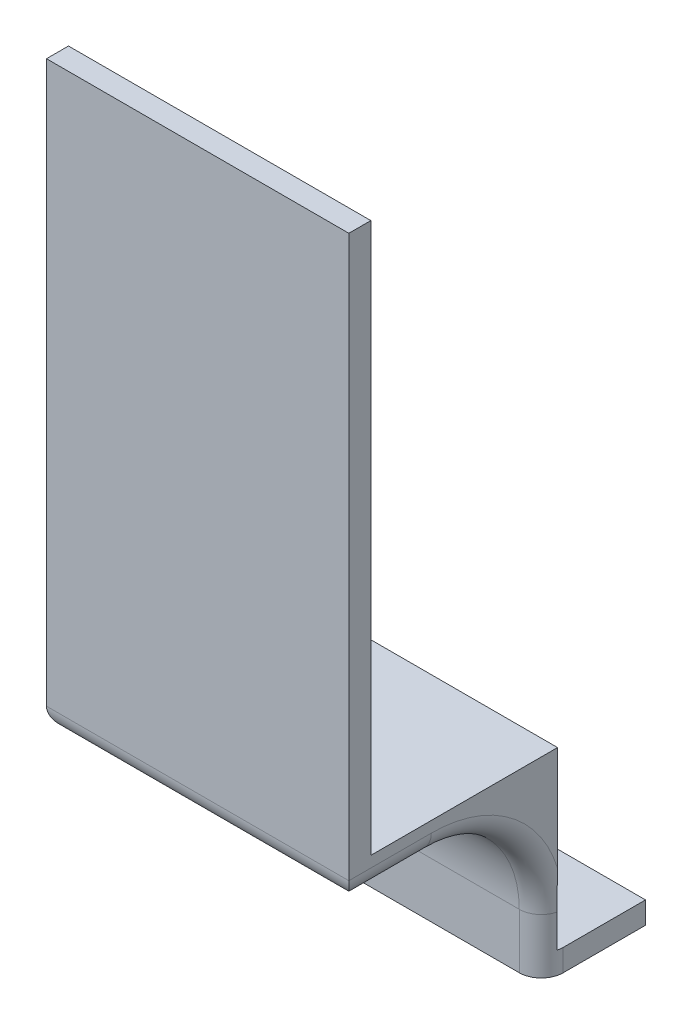
ISO-10303-21;
HEADER;
FILE_DESCRIPTION(('STEP AP214'),'2;1');
FILE_NAME('part.step','',(''),(''),'','','');
FILE_SCHEMA(('AUTOMOTIVE_DESIGN { 1 0 10303 214 1 1 1 1 }'));
ENDSEC;
DATA;
#1=APPLICATION_CONTEXT('core data for automotive mechanical design processes');
#2=APPLICATION_PROTOCOL_DEFINITION('international standard','automotive_design',2000,#1);
#3=PRODUCT_CONTEXT('',#1,'mechanical');
#4=PRODUCT('Part','Part','',(#3));
#5=PRODUCT_RELATED_PRODUCT_CATEGORY('part','',(#4));
#6=PRODUCT_DEFINITION_FORMATION('','',#4);
#7=PRODUCT_DEFINITION_CONTEXT('part definition',#1,'design');
#8=PRODUCT_DEFINITION('design','',#6,#7);
#9=PRODUCT_DEFINITION_SHAPE('','',#8);
#10=(LENGTH_UNIT() NAMED_UNIT(*) SI_UNIT(.MILLI.,.METRE.));
#11=(NAMED_UNIT(*) PLANE_ANGLE_UNIT() SI_UNIT($,.RADIAN.));
#12=(NAMED_UNIT(*) SI_UNIT($,.STERADIAN.) SOLID_ANGLE_UNIT());
#13=UNCERTAINTY_MEASURE_WITH_UNIT(LENGTH_MEASURE(1.E-05),#10,'distance_accuracy_value','');
#14=(GEOMETRIC_REPRESENTATION_CONTEXT(3) GLOBAL_UNCERTAINTY_ASSIGNED_CONTEXT((#13)) GLOBAL_UNIT_ASSIGNED_CONTEXT((#10,
#11,#12)) REPRESENTATION_CONTEXT('',''));
#15=CARTESIAN_POINT('',(0.,0.,0.));
#16=DIRECTION('',(0.,0.,1.));
#17=DIRECTION('',(1.,0.,0.));
#18=AXIS2_PLACEMENT_3D('',#15,#16,#17);
#19=CARTESIAN_POINT('',(15.,6.,-5.5));
#20=DIRECTION('',(-1.,0.,0.));
#21=DIRECTION('',(0.,0.,1.));
#22=AXIS2_PLACEMENT_3D('',#19,#20,#21);
#23=PLANE('',#22);
#24=DIRECTION('',(0.,0.,-1.));
#25=VECTOR('',#24,1.);
#26=CARTESIAN_POINT('',(15.,68.,2.5));
#27=LINE('',#26,#25);
#28=CARTESIAN_POINT('',(15.,68.,21.4824022050211));
#29=VERTEX_POINT('',#28);
#30=CARTESIAN_POINT('',(15.,68.,19.4824022050211));
#31=VERTEX_POINT('',#30);
#32=EDGE_CURVE('E168',#29,#31,#27,.T.);
#33=ORIENTED_EDGE('',*,*,#32,.F.);
#34=DIRECTION('',(0.,-1.,0.));
#35=VECTOR('',#34,1.);
#36=CARTESIAN_POINT('',(15.,68.,21.4824022050211));
#37=LINE('',#36,#35);
#38=CARTESIAN_POINT('',(15.,17.,21.4824022050211));
#39=VERTEX_POINT('',#38);
#40=EDGE_CURVE('E172',#29,#39,#37,.T.);
#41=ORIENTED_EDGE('',*,*,#40,.T.);
#42=DIRECTION('',(0.,0.,-1.));
#43=VECTOR('',#42,1.);
#44=CARTESIAN_POINT('',(15.,17.,-5.5));
#45=LINE('',#44,#43);
#46=CARTESIAN_POINT('',(15.,17.,13.9824022050211));
#47=VERTEX_POINT('',#46);
#48=EDGE_CURVE('E263',#39,#47,#45,.T.);
#49=ORIENTED_EDGE('',*,*,#48,.T.);
#50=CARTESIAN_POINT('',(15.,5.,13.9824022050211));
#51=DIRECTION('',(-1.,0.,0.));
#52=DIRECTION('',(0.,0.,1.));
#53=AXIS2_PLACEMENT_3D('',#50,#51,#52);
#54=CIRCLE('',#53,12.);
#55=CARTESIAN_POINT('',(15.,8.48632178694496,2.5));
#56=VERTEX_POINT('',#55);
#57=EDGE_CURVE('E262',#47,#56,#54,.T.);
#58=ORIENTED_EDGE('',*,*,#57,.T.);
#59=DIRECTION('',(0.,-1.,0.));
#60=VECTOR('',#59,1.);
#61=CARTESIAN_POINT('',(15.,18.,2.5));
#62=LINE('',#61,#60);
#63=CARTESIAN_POINT('',(15.,18.,2.5));
#64=VERTEX_POINT('',#63);
#65=EDGE_CURVE('E209',#64,#56,#62,.T.);
#66=ORIENTED_EDGE('',*,*,#65,.F.);
#67=DIRECTION('',(0.,0.,-1.));
#68=VECTOR('',#67,1.);
#69=CARTESIAN_POINT('',(15.,18.,5.5));
#70=LINE('',#69,#68);
#71=CARTESIAN_POINT('',(15.,18.,19.4824022050211));
#72=VERTEX_POINT('',#71);
#73=EDGE_CURVE('E213',#72,#64,#70,.T.);
#74=ORIENTED_EDGE('',*,*,#73,.F.);
#75=DIRECTION('',(0.,-1.,0.));
#76=VECTOR('',#75,1.);
#77=CARTESIAN_POINT('',(15.,68.,19.4824022050211));
#78=LINE('',#77,#76);
#79=EDGE_CURVE('E180',#31,#72,#78,.T.);
#80=ORIENTED_EDGE('',*,*,#79,.F.);
#81=EDGE_LOOP('',(#33,#41,#49,#58,#66,#74,#80));
#82=FACE_BOUND('',#81,.T.);
#83=ADVANCED_FACE('F50',(#82),#23,.F.);
#84=DIRECTION('',(0.,0.,1.));
#85=VECTOR('',#84,1.);
#86=CARTESIAN_POINT('',(15.,2.,-5.5));
#87=LINE('',#86,#85);
#88=CARTESIAN_POINT('',(15.,2.,-5.5));
#89=VERTEX_POINT('',#88);
#90=CARTESIAN_POINT('',(15.,2.,1.98240220502108));
#91=VERTEX_POINT('',#90);
#92=EDGE_CURVE('E236',#89,#91,#87,.T.);
#93=ORIENTED_EDGE('',*,*,#92,.T.);
#94=DIRECTION('',(0.,1.,0.));
#95=VECTOR('',#94,1.);
#96=CARTESIAN_POINT('',(15.,6.,1.98240220502108));
#97=LINE('',#96,#95);
#98=CARTESIAN_POINT('',(15.,0.,1.98240220502108));
#99=VERTEX_POINT('',#98);
#100=EDGE_CURVE('E261',#91,#99,#97,.F.);
#101=ORIENTED_EDGE('',*,*,#100,.T.);
#102=DIRECTION('',(0.,0.,-1.));
#103=VECTOR('',#102,1.);
#104=CARTESIAN_POINT('',(15.,0.,-5.5));
#105=LINE('',#104,#103);
#106=CARTESIAN_POINT('',(15.,0.,-5.5));
#107=VERTEX_POINT('',#106);
#108=EDGE_CURVE('E237',#99,#107,#105,.T.);
#109=ORIENTED_EDGE('',*,*,#108,.T.);
#110=DIRECTION('',(0.,-1.,0.));
#111=VECTOR('',#110,1.);
#112=CARTESIAN_POINT('',(15.,6.,-5.5));
#113=LINE('',#112,#111);
#114=EDGE_CURVE('E242',#89,#107,#113,.T.);
#115=ORIENTED_EDGE('',*,*,#114,.F.);
#116=EDGE_LOOP('',(#93,#101,#109,#115));
#117=FACE_BOUND('',#116,.T.);
#118=ADVANCED_FACE('F326',(#117),#23,.F.);
#119=CARTESIAN_POINT('',(-12.5,0.,0.));
#120=DIRECTION('',(1.,0.,0.));
#121=DIRECTION('',(0.,0.,-1.));
#122=AXIS2_PLACEMENT_3D('',#119,#120,#121);
#123=PLANE('',#122);
#124=DIRECTION('',(0.,0.,1.));
#125=VECTOR('',#124,1.);
#126=CARTESIAN_POINT('',(-12.5,0.,-5.5));
#127=LINE('',#126,#125);
#128=CARTESIAN_POINT('',(-12.5,0.,-5.5));
#129=VERTEX_POINT('',#128);
#130=CARTESIAN_POINT('',(-12.5,0.,1.98240220502108));
#131=VERTEX_POINT('',#130);
#132=EDGE_CURVE('E217',#129,#131,#127,.T.);
#133=ORIENTED_EDGE('',*,*,#132,.T.);
#134=DIRECTION('',(0.,1.,0.));
#135=VECTOR('',#134,1.);
#136=CARTESIAN_POINT('',(-12.5,0.,1.98240220502108));
#137=LINE('',#136,#135);
#138=CARTESIAN_POINT('',(-12.5,2.,1.98240220502108));
#139=VERTEX_POINT('',#138);
#140=EDGE_CURVE('E258',#131,#139,#137,.T.);
#141=ORIENTED_EDGE('',*,*,#140,.T.);
#142=DIRECTION('',(0.,0.,1.));
#143=VECTOR('',#142,1.);
#144=CARTESIAN_POINT('',(-12.5,2.,-13.5));
#145=LINE('',#144,#143);
#146=CARTESIAN_POINT('',(-12.5,2.,-5.5));
#147=VERTEX_POINT('',#146);
#148=EDGE_CURVE('E223',#147,#139,#145,.T.);
#149=ORIENTED_EDGE('',*,*,#148,.F.);
#150=DIRECTION('',(0.,-1.,0.));
#151=VECTOR('',#150,1.);
#152=CARTESIAN_POINT('',(-12.5,0.,-5.5));
#153=LINE('',#152,#151);
#154=EDGE_CURVE('E218',#147,#129,#153,.T.);
#155=ORIENTED_EDGE('',*,*,#154,.T.);
#156=EDGE_LOOP('',(#133,#141,#149,#155));
#157=FACE_BOUND('',#156,.T.);
#158=ADVANCED_FACE('F334',(#157),#123,.F.);
#159=CARTESIAN_POINT('',(-32.,18.,3.98240220502108));
#160=DIRECTION('',(0.,0.,-1.));
#161=DIRECTION('',(0.,1.,0.));
#162=AXIS2_PLACEMENT_3D('',#159,#160,#161);
#163=PLANE('',#162);
#164=DIRECTION('',(1.,0.,0.));
#165=VECTOR('',#164,1.);
#166=CARTESIAN_POINT('',(-32.,0.,3.98240220502108));
#167=LINE('',#166,#165);
#168=CARTESIAN_POINT('',(-10.5,0.,3.98240220502108));
#169=VERTEX_POINT('',#168);
#170=CARTESIAN_POINT('',(13.,0.,3.98240220502108));
#171=VERTEX_POINT('',#170);
#172=EDGE_CURVE('E199',#169,#171,#167,.T.);
#173=ORIENTED_EDGE('',*,*,#172,.T.);
#174=DIRECTION('',(0.,1.,0.));
#175=VECTOR('',#174,1.);
#176=CARTESIAN_POINT('',(13.,18.,3.98240220502108));
#177=LINE('',#176,#175);
#178=CARTESIAN_POINT('',(13.,5.,3.98240220502108));
#179=VERTEX_POINT('',#178);
#180=EDGE_CURVE('E267',#171,#179,#177,.T.);
#181=ORIENTED_EDGE('',*,*,#180,.T.);
#182=DIRECTION('',(1.,0.,0.));
#183=VECTOR('',#182,1.);
#184=CARTESIAN_POINT('',(-12.5,5.,3.98240220502108));
#185=LINE('',#184,#183);
#186=CARTESIAN_POINT('',(-10.5,5.,3.98240220502108));
#187=VERTEX_POINT('',#186);
#188=EDGE_CURVE('E252',#179,#187,#185,.F.);
#189=ORIENTED_EDGE('',*,*,#188,.T.);
#190=DIRECTION('',(0.,1.,0.));
#191=VECTOR('',#190,1.);
#192=CARTESIAN_POINT('',(-10.5,18.,3.98240220502108));
#193=LINE('',#192,#191);
#194=EDGE_CURVE('E270',#187,#169,#193,.F.);
#195=ORIENTED_EDGE('',*,*,#194,.T.);
#196=EDGE_LOOP('',(#173,#181,#189,#195));
#197=FACE_BOUND('',#196,.T.);
#198=ADVANCED_FACE('F292',(#197),#163,.F.);
#199=CARTESIAN_POINT('',(0.,0.,0.));
#200=DIRECTION('',(0.,1.,0.));
#201=DIRECTION('',(0.,0.,1.));
#202=AXIS2_PLACEMENT_3D('',#199,#200,#201);
#203=PLANE('',#202);
#204=CARTESIAN_POINT('',(-7.5,0.,-2.));
#205=DIRECTION('',(0.,1.,0.));
#206=DIRECTION('',(0.,0.,1.));
#207=AXIS2_PLACEMENT_3D('',#204,#205,#206);
#208=CIRCLE('',#207,1.75);
#209=CARTESIAN_POINT('',(-7.5,0.,-0.25));
#210=VERTEX_POINT('',#209);
#211=EDGE_CURVE('E231',#210,#210,#208,.T.);
#212=ORIENTED_EDGE('',*,*,#211,.T.);
#213=EDGE_LOOP('',(#212));
#214=FACE_BOUND('',#213,.T.);
#215=CARTESIAN_POINT('',(7.5,0.,-2.));
#216=DIRECTION('',(0.,1.,0.));
#217=DIRECTION('',(0.,0.,1.));
#218=AXIS2_PLACEMENT_3D('',#215,#216,#217);
#219=CIRCLE('',#218,1.75);
#220=CARTESIAN_POINT('',(7.5,0.,-0.249999999999999));
#221=VERTEX_POINT('',#220);
#222=EDGE_CURVE('E227',#221,#221,#219,.T.);
#223=ORIENTED_EDGE('',*,*,#222,.T.);
#224=EDGE_LOOP('',(#223));
#225=FACE_BOUND('',#224,.T.);
#226=ORIENTED_EDGE('',*,*,#108,.F.);
#227=CARTESIAN_POINT('',(13.,0.,1.98240220502108));
#228=DIRECTION('',(0.,1.,0.));
#229=DIRECTION('',(0.,0.,1.));
#230=AXIS2_PLACEMENT_3D('',#227,#228,#229);
#231=CIRCLE('',#230,2.);
#232=EDGE_CURVE('E394',#99,#171,#231,.F.);
#233=ORIENTED_EDGE('',*,*,#232,.T.);
#234=ORIENTED_EDGE('',*,*,#172,.F.);
#235=CARTESIAN_POINT('',(-10.5,0.,1.98240220502108));
#236=DIRECTION('',(0.,1.,0.));
#237=DIRECTION('',(0.,0.,1.));
#238=AXIS2_PLACEMENT_3D('',#235,#236,#237);
#239=CIRCLE('',#238,2.);
#240=EDGE_CURVE('E367',#169,#131,#239,.F.);
#241=ORIENTED_EDGE('',*,*,#240,.T.);
#242=ORIENTED_EDGE('',*,*,#132,.F.);
#243=DIRECTION('',(-1.,0.,0.));
#244=VECTOR('',#243,1.);
#245=CARTESIAN_POINT('',(-15.,0.,-5.5));
#246=LINE('',#245,#244);
#247=EDGE_CURVE('E241',#107,#129,#246,.T.);
#248=ORIENTED_EDGE('',*,*,#247,.F.);
#249=EDGE_LOOP('',(#226,#233,#234,#241,#242,#248));
#250=FACE_BOUND('',#249,.T.);
#251=ADVANCED_FACE('F412',(#214,#225,#250),#203,.F.);
#252=CARTESIAN_POINT('',(0.,18.,0.));
#253=DIRECTION('',(0.,1.,0.));
#254=DIRECTION('',(0.,0.,1.));
#255=AXIS2_PLACEMENT_3D('',#252,#253,#254);
#256=PLANE('',#255);
#257=DIRECTION('',(0.,0.,1.));
#258=VECTOR('',#257,1.);
#259=CARTESIAN_POINT('',(-12.5,18.,5.5));
#260=LINE('',#259,#258);
#261=CARTESIAN_POINT('',(-12.5,18.,2.5));
#262=VERTEX_POINT('',#261);
#263=CARTESIAN_POINT('',(-12.5,18.,19.4824022050211));
#264=VERTEX_POINT('',#263);
#265=EDGE_CURVE('E215',#262,#264,#260,.T.);
#266=ORIENTED_EDGE('',*,*,#265,.T.);
#267=DIRECTION('',(-1.,0.,0.));
#268=VECTOR('',#267,1.);
#269=CARTESIAN_POINT('',(-12.5,18.,19.4824022050211));
#270=LINE('',#269,#268);
#271=EDGE_CURVE('E187',#72,#264,#270,.T.);
#272=ORIENTED_EDGE('',*,*,#271,.F.);
#273=ORIENTED_EDGE('',*,*,#73,.T.);
#274=DIRECTION('',(-1.,0.,0.));
#275=VECTOR('',#274,1.);
#276=CARTESIAN_POINT('',(-12.5,18.,2.5));
#277=LINE('',#276,#275);
#278=EDGE_CURVE('E203',#64,#262,#277,.T.);
#279=ORIENTED_EDGE('',*,*,#278,.T.);
#280=EDGE_LOOP('',(#266,#272,#273,#279));
#281=FACE_BOUND('',#280,.T.);
#282=ADVANCED_FACE('F295',(#281),#256,.T.);
#283=CARTESIAN_POINT('',(129.,2.,-13.5));
#284=DIRECTION('',(0.,-1.,0.));
#285=DIRECTION('',(0.,0.,-1.));
#286=AXIS2_PLACEMENT_3D('',#283,#284,#285);
#287=PLANE('',#286);
#288=CARTESIAN_POINT('',(7.5,2.,-2.));
#289=DIRECTION('',(0.,-1.,0.));
#290=DIRECTION('',(0.,0.,-1.));
#291=AXIS2_PLACEMENT_3D('',#288,#289,#290);
#292=CIRCLE('',#291,1.75);
#293=CARTESIAN_POINT('',(7.5,2.,-3.75));
#294=VERTEX_POINT('',#293);
#295=EDGE_CURVE('E222',#294,#294,#292,.T.);
#296=ORIENTED_EDGE('',*,*,#295,.T.);
#297=EDGE_LOOP('',(#296));
#298=FACE_BOUND('',#297,.T.);
#299=CARTESIAN_POINT('',(-7.5,2.,-2.));
#300=DIRECTION('',(0.,-1.,0.));
#301=DIRECTION('',(0.,0.,-1.));
#302=AXIS2_PLACEMENT_3D('',#299,#300,#301);
#303=CIRCLE('',#302,1.75);
#304=CARTESIAN_POINT('',(-7.5,2.,-3.75));
#305=VERTEX_POINT('',#304);
#306=EDGE_CURVE('E229',#305,#305,#303,.T.);
#307=ORIENTED_EDGE('',*,*,#306,.T.);
#308=EDGE_LOOP('',(#307));
#309=FACE_BOUND('',#308,.T.);
#310=DIRECTION('',(-1.,0.,0.));
#311=VECTOR('',#310,1.);
#312=CARTESIAN_POINT('',(-12.5,2.,2.5));
#313=LINE('',#312,#311);
#314=CARTESIAN_POINT('',(14.931862449201,2.,2.5));
#315=VERTEX_POINT('',#314);
#316=CARTESIAN_POINT('',(-12.431862449201,2.,2.5));
#317=VERTEX_POINT('',#316);
#318=EDGE_CURVE('E196',#315,#317,#313,.T.);
#319=ORIENTED_EDGE('',*,*,#318,.F.);
#320=CARTESIAN_POINT('',(13.,2.,1.98240220502108));
#321=DIRECTION('',(0.,-1.,0.));
#322=DIRECTION('',(0.,0.,-1.));
#323=AXIS2_PLACEMENT_3D('',#320,#321,#322);
#324=CIRCLE('',#323,2.);
#325=EDGE_CURVE('E391',#315,#91,#324,.F.);
#326=ORIENTED_EDGE('',*,*,#325,.T.);
#327=ORIENTED_EDGE('',*,*,#92,.F.);
#328=DIRECTION('',(1.,0.,0.));
#329=VECTOR('',#328,1.);
#330=CARTESIAN_POINT('',(-15.,2.,-5.5));
#331=LINE('',#330,#329);
#332=EDGE_CURVE('E250',#147,#89,#331,.T.);
#333=ORIENTED_EDGE('',*,*,#332,.F.);
#334=ORIENTED_EDGE('',*,*,#148,.T.);
#335=CARTESIAN_POINT('',(-10.5,2.,1.98240220502108));
#336=DIRECTION('',(0.,-1.,0.));
#337=DIRECTION('',(0.,0.,-1.));
#338=AXIS2_PLACEMENT_3D('',#335,#336,#337);
#339=CIRCLE('',#338,2.);
#340=EDGE_CURVE('E398',#139,#317,#339,.F.);
#341=ORIENTED_EDGE('',*,*,#340,.T.);
#342=EDGE_LOOP('',(#319,#326,#327,#333,#334,#341));
#343=FACE_BOUND('',#342,.T.);
#344=ADVANCED_FACE('F403',(#298,#309,#343),#287,.F.);
#345=DIRECTION('',(0.,-1.,0.));
#346=VECTOR('',#345,1.);
#347=CARTESIAN_POINT('',(-12.5,68.,21.4824022050211));
#348=LINE('',#347,#346);
#349=CARTESIAN_POINT('',(-12.5,68.,21.4824022050211));
#350=VERTEX_POINT('',#349);
#351=CARTESIAN_POINT('',(-12.5,17.,21.4824022050211));
#352=VERTEX_POINT('',#351);
#353=EDGE_CURVE('E183',#350,#352,#348,.T.);
#354=ORIENTED_EDGE('',*,*,#353,.F.);
#355=DIRECTION('',(0.,0.,-1.));
#356=VECTOR('',#355,1.);
#357=CARTESIAN_POINT('',(-12.5,68.,0.));
#358=LINE('',#357,#356);
#359=CARTESIAN_POINT('',(-12.5,68.,19.4824022050211));
#360=VERTEX_POINT('',#359);
#361=EDGE_CURVE('E11',#350,#360,#358,.T.);
#362=ORIENTED_EDGE('',*,*,#361,.T.);
#363=DIRECTION('',(0.,-1.,0.));
#364=VECTOR('',#363,1.);
#365=CARTESIAN_POINT('',(-12.5,68.,19.4824022050211));
#366=LINE('',#365,#364);
#367=EDGE_CURVE('E189',#360,#264,#366,.T.);
#368=ORIENTED_EDGE('',*,*,#367,.T.);
#369=ORIENTED_EDGE('',*,*,#265,.F.);
#370=DIRECTION('',(0.,-1.,0.));
#371=VECTOR('',#370,1.);
#372=CARTESIAN_POINT('',(-12.5,18.,2.5));
#373=LINE('',#372,#371);
#374=CARTESIAN_POINT('',(-12.5,8.48632178694496,2.5));
#375=VERTEX_POINT('',#374);
#376=EDGE_CURVE('E202',#262,#375,#373,.T.);
#377=ORIENTED_EDGE('',*,*,#376,.T.);
#378=CARTESIAN_POINT('',(-12.5,5.,13.9824022050211));
#379=DIRECTION('',(1.,0.,0.));
#380=DIRECTION('',(0.,0.,-1.));
#381=AXIS2_PLACEMENT_3D('',#378,#379,#380);
#382=CIRCLE('',#381,12.);
#383=CARTESIAN_POINT('',(-12.5,17.,13.9824022050211));
#384=VERTEX_POINT('',#383);
#385=EDGE_CURVE('E260',#375,#384,#382,.T.);
#386=ORIENTED_EDGE('',*,*,#385,.T.);
#387=DIRECTION('',(0.,0.,-1.));
#388=VECTOR('',#387,1.);
#389=CARTESIAN_POINT('',(-12.5,17.,0.));
#390=LINE('',#389,#388);
#391=EDGE_CURVE('E251',#384,#352,#390,.F.);
#392=ORIENTED_EDGE('',*,*,#391,.T.);
#393=EDGE_LOOP('',(#354,#362,#368,#369,#377,#386,#392));
#394=FACE_BOUND('',#393,.T.);
#395=ADVANCED_FACE('F422',(#394),#123,.F.);
#396=CARTESIAN_POINT('',(-15.,6.,-5.5));
#397=DIRECTION('',(0.,0.,1.));
#398=DIRECTION('',(1.,0.,0.));
#399=AXIS2_PLACEMENT_3D('',#396,#397,#398);
#400=PLANE('',#399);
#401=ORIENTED_EDGE('',*,*,#154,.F.);
#402=ORIENTED_EDGE('',*,*,#332,.T.);
#403=ORIENTED_EDGE('',*,*,#114,.T.);
#404=ORIENTED_EDGE('',*,*,#247,.T.);
#405=EDGE_LOOP('',(#401,#402,#403,#404));
#406=FACE_BOUND('',#405,.T.);
#407=ADVANCED_FACE('F336',(#406),#400,.F.);
#408=CARTESIAN_POINT('',(7.5,-138.,-2.));
#409=DIRECTION('',(0.,1.,0.));
#410=DIRECTION('',(0.,0.,1.));
#411=AXIS2_PLACEMENT_3D('',#408,#409,#410);
#412=CYLINDRICAL_SURFACE('',#411,1.75);
#413=ORIENTED_EDGE('',*,*,#295,.F.);
#414=EDGE_LOOP('',(#413));
#415=FACE_BOUND('',#414,.T.);
#416=ORIENTED_EDGE('',*,*,#222,.F.);
#417=EDGE_LOOP('',(#416));
#418=FACE_BOUND('',#417,.T.);
#419=ADVANCED_FACE('F447',(#415,#418),#412,.F.);
#420=CARTESIAN_POINT('',(-7.5,-138.,-2.));
#421=DIRECTION('',(0.,1.,0.));
#422=DIRECTION('',(0.,0.,1.));
#423=AXIS2_PLACEMENT_3D('',#420,#421,#422);
#424=CYLINDRICAL_SURFACE('',#423,1.75);
#425=ORIENTED_EDGE('',*,*,#306,.F.);
#426=EDGE_LOOP('',(#425));
#427=FACE_BOUND('',#426,.T.);
#428=ORIENTED_EDGE('',*,*,#211,.F.);
#429=EDGE_LOOP('',(#428));
#430=FACE_BOUND('',#429,.T.);
#431=ADVANCED_FACE('F289',(#427,#430),#424,.F.);
#432=CARTESIAN_POINT('',(-12.5,18.,2.5));
#433=DIRECTION('',(0.,0.,1.));
#434=DIRECTION('',(1.,0.,0.));
#435=AXIS2_PLACEMENT_3D('',#432,#433,#434);
#436=PLANE('',#435);
#437=CARTESIAN_POINT('',(15.,8.48632178694496,2.5));
#438=CARTESIAN_POINT('',(14.999973420591,8.31960303272044,2.5));
#439=CARTESIAN_POINT('',(14.9982400581002,8.152903489605,2.5));
#440=CARTESIAN_POINT('',(14.9925507811653,7.81955774633867,2.5));
#441=CARTESIAN_POINT('',(14.9885951074428,7.65291154236594,2.5));
#442=CARTESIAN_POINT('',(14.9796521788594,7.31966910606931,2.5));
#443=CARTESIAN_POINT('',(14.9746650343504,7.15307287030739,2.5));
#444=CARTESIAN_POINT('',(14.9646588404704,6.81987626461114,2.5));
#445=CARTESIAN_POINT('',(14.9596397902377,6.65327589468723,2.5));
#446=CARTESIAN_POINT('',(14.9504086860296,6.32001584590415,2.5));
#447=CARTESIAN_POINT('',(14.9461968058806,6.15335616199604,2.5));
#448=CARTESIAN_POINT('',(14.9392149448494,5.82000917255926,2.5));
#449=CARTESIAN_POINT('',(14.9364449289972,5.65332186779859,2.5));
#450=CARTESIAN_POINT('',(14.9327440496714,5.31991949717741,2.5));
#451=CARTESIAN_POINT('',(14.9318132522582,5.15320443053485,2.5));
#452=CARTESIAN_POINT('',(14.9318902435984,4.90312691509881,2.5));
#453=CARTESIAN_POINT('',(14.9321614778445,4.81976367997256,2.5));
#454=CARTESIAN_POINT('',(14.9331794494329,4.65304001678202,2.5));
#455=CARTESIAN_POINT('',(14.9339261872392,4.56967958872056,2.5));
#456=CARTESIAN_POINT('',(14.9349028589517,4.48632178694496,2.5));
#457=B_SPLINE_CURVE_WITH_KNOTS('',3,(#437,#438,#439,#440,#441,#442,#443,#444,#445,#446,#447,
#448,#449,#450,#451,#452,#453,#454,#455,#456),.UNSPECIFIED.,.F.,.F.,(4,2,2,2,2,2,2,2,2,4),(0.,
0.500121393637863,1.00018862437835,1.50020238311694,2.00022970331413,2.50036458516036,
3.0004873365191,3.50062805082612,3.75071787258557,4.00080793849823),.UNSPECIFIED.);
#458=CARTESIAN_POINT('',(14.931862449201,5.,2.5));
#459=VERTEX_POINT('',#458);
#460=EDGE_CURVE('E300',#56,#459,#457,.T.);
#461=ORIENTED_EDGE('',*,*,#460,.T.);
#462=DIRECTION('',(0.,1.,0.));
#463=VECTOR('',#462,1.);
#464=CARTESIAN_POINT('',(14.931862449201,18.,2.5));
#465=LINE('',#464,#463);
#466=EDGE_CURVE('E302',#459,#315,#465,.F.);
#467=ORIENTED_EDGE('',*,*,#466,.T.);
#468=ORIENTED_EDGE('',*,*,#318,.T.);
#469=DIRECTION('',(0.,1.,0.));
#470=VECTOR('',#469,1.);
#471=CARTESIAN_POINT('',(-12.431862449201,0.,2.5));
#472=LINE('',#471,#470);
#473=CARTESIAN_POINT('',(-12.431862449201,5.,2.5));
#474=VERTEX_POINT('',#473);
#475=EDGE_CURVE('E278',#317,#474,#472,.T.);
#476=ORIENTED_EDGE('',*,*,#475,.T.);
#477=CARTESIAN_POINT('',(-12.431862449201,5.,2.5));
#478=CARTESIAN_POINT('',(-12.4318148867941,5.16670298116622,2.5));
#479=CARTESIAN_POINT('',(-12.4328338469345,5.3334022257757,2.5));
#480=CARTESIAN_POINT('',(-12.4366579986235,5.66676241533547,2.5));
#481=CARTESIAN_POINT('',(-12.4394629927171,5.8334233624825,2.5));
#482=CARTESIAN_POINT('',(-12.4465124250425,6.16670748968213,2.5));
#483=CARTESIAN_POINT('',(-12.4507568157662,6.33333067079962,2.5));
#484=CARTESIAN_POINT('',(-12.4600301737338,6.66656221557473,2.5));
#485=CARTESIAN_POINT('',(-12.4650591797378,6.83317057809326,2.5));
#486=CARTESIAN_POINT('',(-12.4750645616875,7.16641356419539,2.5));
#487=CARTESIAN_POINT('',(-12.4800409298515,7.33304818806561,2.5));
#488=CARTESIAN_POINT('',(-12.488923031305,7.6663342898719,2.5));
#489=CARTESIAN_POINT('',(-12.4928288472173,7.83298576551375,2.5));
#490=CARTESIAN_POINT('',(-12.49841698057,8.16635030685006,2.5));
#491=CARTESIAN_POINT('',(-12.5000991008819,8.33306337669457,2.5));
#492=CARTESIAN_POINT('',(-12.4998932082432,8.66652778105561,2.5));
#493=CARTESIAN_POINT('',(-12.4980042255866,8.83327911366794,2.5));
#494=CARTESIAN_POINT('',(-12.4936556896548,9.,2.5));
#495=B_SPLINE_CURVE_WITH_KNOTS('',3,(#477,#478,#479,#480,#481,#482,#483,#484,#485,#486,#487,
#488,#489,#490,#491,#492,#493,#494),.UNSPECIFIED.,.F.,.F.,(4,2,2,2,2,2,2,2,4),(0.,
0.500099846565039,1.00014441417451,1.50017247911111,2.00022525328886,2.50035094763816,
3.00043803254286,3.50056944669001,4.00083668723549),.UNSPECIFIED.);
#496=EDGE_CURVE('E275',#474,#375,#495,.T.);
#497=ORIENTED_EDGE('',*,*,#496,.T.);
#498=ORIENTED_EDGE('',*,*,#376,.F.);
#499=ORIENTED_EDGE('',*,*,#278,.F.);
#500=ORIENTED_EDGE('',*,*,#65,.T.);
#501=EDGE_LOOP('',(#461,#467,#468,#476,#497,#498,#499,#500));
#502=FACE_BOUND('',#501,.T.);
#503=ADVANCED_FACE('F285',(#502),#436,.F.);
#504=CARTESIAN_POINT('',(-12.5,15.,19.4824022050211));
#505=DIRECTION('',(0.,1.,0.));
#506=DIRECTION('',(0.,0.,1.));
#507=AXIS2_PLACEMENT_3D('',#504,#505,#506);
#508=PLANE('',#507);
#509=DIRECTION('',(1.,0.,0.));
#510=VECTOR('',#509,1.);
#511=CARTESIAN_POINT('',(15.,15.,13.9824022050211));
#512=LINE('',#511,#510);
#513=CARTESIAN_POINT('',(-10.5,15.,13.9824022050211));
#514=VERTEX_POINT('',#513);
#515=CARTESIAN_POINT('',(13.,15.,13.9824022050211));
#516=VERTEX_POINT('',#515);
#517=EDGE_CURVE('E248',#514,#516,#512,.T.);
#518=ORIENTED_EDGE('',*,*,#517,.T.);
#519=DIRECTION('',(0.,0.,-1.));
#520=VECTOR('',#519,1.);
#521=CARTESIAN_POINT('',(13.,15.,19.4824022050211));
#522=LINE('',#521,#520);
#523=CARTESIAN_POINT('',(13.,15.,19.4824022050211));
#524=VERTEX_POINT('',#523);
#525=EDGE_CURVE('E54',#516,#524,#522,.F.);
#526=ORIENTED_EDGE('',*,*,#525,.T.);
#527=DIRECTION('',(-1.,0.,0.));
#528=VECTOR('',#527,1.);
#529=CARTESIAN_POINT('',(-12.5,15.,19.4824022050211));
#530=LINE('',#529,#528);
#531=CARTESIAN_POINT('',(-10.5,15.,19.4824022050211));
#532=VERTEX_POINT('',#531);
#533=EDGE_CURVE('E64',#524,#532,#530,.T.);
#534=ORIENTED_EDGE('',*,*,#533,.T.);
#535=DIRECTION('',(0.,0.,-1.));
#536=VECTOR('',#535,1.);
#537=CARTESIAN_POINT('',(-10.5,15.,19.4824022050211));
#538=LINE('',#537,#536);
#539=EDGE_CURVE('E390',#532,#514,#538,.T.);
#540=ORIENTED_EDGE('',*,*,#539,.T.);
#541=EDGE_LOOP('',(#518,#526,#534,#540));
#542=FACE_BOUND('',#541,.T.);
#543=ADVANCED_FACE('F287',(#542),#508,.F.);
#544=CARTESIAN_POINT('',(-12.5,68.,21.4824022050211));
#545=DIRECTION('',(0.,0.,1.));
#546=DIRECTION('',(1.,0.,0.));
#547=AXIS2_PLACEMENT_3D('',#544,#545,#546);
#548=PLANE('',#547);
#549=DIRECTION('',(1.,0.,0.));
#550=VECTOR('',#549,1.);
#551=CARTESIAN_POINT('',(-48.,68.,21.4824022050211));
#552=LINE('',#551,#550);
#553=EDGE_CURVE('E161',#350,#29,#552,.T.);
#554=ORIENTED_EDGE('',*,*,#553,.F.);
#555=ORIENTED_EDGE('',*,*,#353,.T.);
#556=DIRECTION('',(-1.,0.,0.));
#557=VECTOR('',#556,1.);
#558=CARTESIAN_POINT('',(15.,17.,21.4824022050211));
#559=LINE('',#558,#557);
#560=EDGE_CURVE('E185',#352,#39,#559,.F.);
#561=ORIENTED_EDGE('',*,*,#560,.T.);
#562=ORIENTED_EDGE('',*,*,#40,.F.);
#563=EDGE_LOOP('',(#554,#555,#561,#562));
#564=FACE_BOUND('',#563,.T.);
#565=ADVANCED_FACE('F179',(#564),#548,.T.);
#566=CARTESIAN_POINT('',(-12.5,68.,19.4824022050211));
#567=DIRECTION('',(0.,0.,-1.));
#568=DIRECTION('',(-1.,0.,0.));
#569=AXIS2_PLACEMENT_3D('',#566,#567,#568);
#570=PLANE('',#569);
#571=ORIENTED_EDGE('',*,*,#79,.T.);
#572=ORIENTED_EDGE('',*,*,#271,.T.);
#573=ORIENTED_EDGE('',*,*,#367,.F.);
#574=DIRECTION('',(1.,0.,0.));
#575=VECTOR('',#574,1.);
#576=CARTESIAN_POINT('',(-12.5,68.,19.4824022050211));
#577=LINE('',#576,#575);
#578=EDGE_CURVE('E193',#360,#31,#577,.T.);
#579=ORIENTED_EDGE('',*,*,#578,.T.);
#580=EDGE_LOOP('',(#571,#572,#573,#579));
#581=FACE_BOUND('',#580,.T.);
#582=ADVANCED_FACE('F345',(#581),#570,.T.);
#583=CARTESIAN_POINT('',(-12.5,5.,13.9824022050211));
#584=DIRECTION('',(-1.,0.,0.));
#585=DIRECTION('',(0.,0.,1.));
#586=AXIS2_PLACEMENT_3D('',#583,#584,#585);
#587=CYLINDRICAL_SURFACE('',#586,10.);
#588=ORIENTED_EDGE('',*,*,#188,.F.);
#589=CARTESIAN_POINT('',(13.,5.,13.9824022050211));
#590=DIRECTION('',(-1.,0.,0.));
#591=DIRECTION('',(0.,0.,1.));
#592=AXIS2_PLACEMENT_3D('',#589,#590,#591);
#593=CIRCLE('',#592,10.);
#594=EDGE_CURVE('E354',#179,#516,#593,.F.);
#595=ORIENTED_EDGE('',*,*,#594,.T.);
#596=ORIENTED_EDGE('',*,*,#517,.F.);
#597=CARTESIAN_POINT('',(-10.5,5.,13.9824022050211));
#598=DIRECTION('',(1.,0.,0.));
#599=DIRECTION('',(0.,0.,-1.));
#600=AXIS2_PLACEMENT_3D('',#597,#598,#599);
#601=CIRCLE('',#600,10.);
#602=EDGE_CURVE('E357',#514,#187,#601,.F.);
#603=ORIENTED_EDGE('',*,*,#602,.T.);
#604=EDGE_LOOP('',(#588,#595,#596,#603));
#605=FACE_BOUND('',#604,.T.);
#606=ADVANCED_FACE('F338',(#605),#587,.F.);
#607=CARTESIAN_POINT('',(-10.5,0.,1.98240220502108));
#608=DIRECTION('',(0.,1.,0.));
#609=DIRECTION('',(0.,0.,1.));
#610=AXIS2_PLACEMENT_3D('',#607,#608,#609);
#611=CYLINDRICAL_SURFACE('',#610,2.);
#612=ORIENTED_EDGE('',*,*,#240,.F.);
#613=ORIENTED_EDGE('',*,*,#194,.F.);
#614=CARTESIAN_POINT('',(-10.5,5.,1.98240220502108));
#615=DIRECTION('',(0.,1.,0.));
#616=DIRECTION('',(0.,0.,1.));
#617=AXIS2_PLACEMENT_3D('',#614,#615,#616);
#618=CIRCLE('',#617,2.);
#619=EDGE_CURVE('E366',#474,#187,#618,.T.);
#620=ORIENTED_EDGE('',*,*,#619,.F.);
#621=ORIENTED_EDGE('',*,*,#475,.F.);
#622=ORIENTED_EDGE('',*,*,#340,.F.);
#623=ORIENTED_EDGE('',*,*,#140,.F.);
#624=EDGE_LOOP('',(#612,#613,#620,#621,#622,#623));
#625=FACE_BOUND('',#624,.T.);
#626=ADVANCED_FACE('F47',(#625),#611,.T.);
#627=CARTESIAN_POINT('',(-10.5,5.,13.9824022050211));
#628=DIRECTION('',(1.,0.,0.));
#629=DIRECTION('',(0.,0.,-1.));
#630=AXIS2_PLACEMENT_3D('',#627,#628,#629);
#631=TOROIDAL_SURFACE('',#630,12.,2.);
#632=ORIENTED_EDGE('',*,*,#619,.T.);
#633=ORIENTED_EDGE('',*,*,#602,.F.);
#634=CARTESIAN_POINT('',(-10.5,17.,13.9824022050211));
#635=DIRECTION('',(0.,0.,1.));
#636=DIRECTION('',(1.,0.,0.));
#637=AXIS2_PLACEMENT_3D('',#634,#635,#636);
#638=CIRCLE('',#637,2.);
#639=EDGE_CURVE('E375',#384,#514,#638,.T.);
#640=ORIENTED_EDGE('',*,*,#639,.F.);
#641=ORIENTED_EDGE('',*,*,#385,.F.);
#642=ORIENTED_EDGE('',*,*,#496,.F.);
#643=EDGE_LOOP('',(#632,#633,#640,#641,#642));
#644=FACE_BOUND('',#643,.T.);
#645=ADVANCED_FACE('F283',(#644),#631,.T.);
#646=CARTESIAN_POINT('',(-10.5,17.,19.4824022050211));
#647=DIRECTION('',(0.,0.,-1.));
#648=DIRECTION('',(-1.,0.,0.));
#649=AXIS2_PLACEMENT_3D('',#646,#647,#648);
#650=CYLINDRICAL_SURFACE('',#649,2.);
#651=ORIENTED_EDGE('',*,*,#639,.T.);
#652=ORIENTED_EDGE('',*,*,#539,.F.);
#653=CARTESIAN_POINT('',(-10.5,17.,19.4824022050211));
#654=DIRECTION('',(-0.707106781186547,0.,-0.707106781186548));
#655=DIRECTION('',(0.707106781186548,0.,-0.707106781186547));
#656=AXIS2_PLACEMENT_3D('',#653,#654,#655);
#657=ELLIPSE('',#656,2.82842712474619,2.);
#658=EDGE_CURVE('E373',#352,#532,#657,.F.);
#659=ORIENTED_EDGE('',*,*,#658,.F.);
#660=ORIENTED_EDGE('',*,*,#391,.F.);
#661=EDGE_LOOP('',(#651,#652,#659,#660));
#662=FACE_BOUND('',#661,.T.);
#663=ADVANCED_FACE('F318',(#662),#650,.T.);
#664=CARTESIAN_POINT('',(-12.5,17.,19.4824022050211));
#665=DIRECTION('',(1.,0.,0.));
#666=DIRECTION('',(0.,0.,-1.));
#667=AXIS2_PLACEMENT_3D('',#664,#665,#666);
#668=CYLINDRICAL_SURFACE('',#667,2.);
#669=ORIENTED_EDGE('',*,*,#658,.T.);
#670=ORIENTED_EDGE('',*,*,#533,.F.);
#671=CARTESIAN_POINT('',(13.,17.,19.4824022050211));
#672=DIRECTION('',(0.707106781186548,0.,-0.707106781186547));
#673=DIRECTION('',(-0.707106781186547,0.,-0.707106781186548));
#674=AXIS2_PLACEMENT_3D('',#671,#672,#673);
#675=ELLIPSE('',#674,2.82842712474619,2.);
#676=EDGE_CURVE('E377',#39,#524,#675,.T.);
#677=ORIENTED_EDGE('',*,*,#676,.F.);
#678=ORIENTED_EDGE('',*,*,#560,.F.);
#679=EDGE_LOOP('',(#669,#670,#677,#678));
#680=FACE_BOUND('',#679,.T.);
#681=ADVANCED_FACE('F320',(#680),#668,.T.);
#682=CARTESIAN_POINT('',(13.,17.,-5.5));
#683=DIRECTION('',(0.,0.,-1.));
#684=DIRECTION('',(-1.,0.,0.));
#685=AXIS2_PLACEMENT_3D('',#682,#683,#684);
#686=CYLINDRICAL_SURFACE('',#685,2.);
#687=ORIENTED_EDGE('',*,*,#676,.T.);
#688=ORIENTED_EDGE('',*,*,#525,.F.);
#689=CARTESIAN_POINT('',(13.,17.,13.9824022050211));
#690=DIRECTION('',(0.,0.,-1.));
#691=DIRECTION('',(-1.,0.,0.));
#692=AXIS2_PLACEMENT_3D('',#689,#690,#691);
#693=CIRCLE('',#692,2.);
#694=EDGE_CURVE('E382',#47,#516,#693,.T.);
#695=ORIENTED_EDGE('',*,*,#694,.F.);
#696=ORIENTED_EDGE('',*,*,#48,.F.);
#697=EDGE_LOOP('',(#687,#688,#695,#696));
#698=FACE_BOUND('',#697,.T.);
#699=ADVANCED_FACE('F315',(#698),#686,.T.);
#700=CARTESIAN_POINT('',(13.,5.,13.9824022050211));
#701=DIRECTION('',(-1.,0.,0.));
#702=DIRECTION('',(0.,0.,1.));
#703=AXIS2_PLACEMENT_3D('',#700,#701,#702);
#704=TOROIDAL_SURFACE('',#703,12.,2.);
#705=ORIENTED_EDGE('',*,*,#694,.T.);
#706=ORIENTED_EDGE('',*,*,#594,.F.);
#707=CARTESIAN_POINT('',(13.,5.,1.98240220502108));
#708=DIRECTION('',(0.,-1.,0.));
#709=DIRECTION('',(0.,0.,-1.));
#710=AXIS2_PLACEMENT_3D('',#707,#708,#709);
#711=CIRCLE('',#710,2.);
#712=EDGE_CURVE('E171',#459,#179,#711,.T.);
#713=ORIENTED_EDGE('',*,*,#712,.F.);
#714=ORIENTED_EDGE('',*,*,#460,.F.);
#715=ORIENTED_EDGE('',*,*,#57,.F.);
#716=EDGE_LOOP('',(#705,#706,#713,#714,#715));
#717=FACE_BOUND('',#716,.T.);
#718=ADVANCED_FACE('F306',(#717),#704,.T.);
#719=CARTESIAN_POINT('',(13.,18.,1.98240220502108));
#720=DIRECTION('',(0.,1.,0.));
#721=DIRECTION('',(0.,0.,1.));
#722=AXIS2_PLACEMENT_3D('',#719,#720,#721);
#723=CYLINDRICAL_SURFACE('',#722,2.);
#724=ORIENTED_EDGE('',*,*,#325,.F.);
#725=ORIENTED_EDGE('',*,*,#466,.F.);
#726=ORIENTED_EDGE('',*,*,#712,.T.);
#727=ORIENTED_EDGE('',*,*,#180,.F.);
#728=ORIENTED_EDGE('',*,*,#232,.F.);
#729=ORIENTED_EDGE('',*,*,#100,.F.);
#730=EDGE_LOOP('',(#724,#725,#726,#727,#728,#729));
#731=FACE_BOUND('',#730,.T.);
#732=ADVANCED_FACE('F311',(#731),#723,.T.);
#733=CARTESIAN_POINT('',(-48.,68.,2.5));
#734=DIRECTION('',(0.,-1.,0.));
#735=DIRECTION('',(0.,0.,-1.));
#736=AXIS2_PLACEMENT_3D('',#733,#734,#735);
#737=PLANE('',#736);
#738=ORIENTED_EDGE('',*,*,#361,.F.);
#739=ORIENTED_EDGE('',*,*,#553,.T.);
#740=ORIENTED_EDGE('',*,*,#32,.T.);
#741=ORIENTED_EDGE('',*,*,#578,.F.);
#742=EDGE_LOOP('',(#738,#739,#740,#741));
#743=FACE_BOUND('',#742,.T.);
#744=ADVANCED_FACE('F164',(#743),#737,.F.);
#745=CLOSED_SHELL('',(#83,#118,#158,#198,#251,#282,#344,#395,#407,#419,#431,#503,#543,#565,#582,
#606,#626,#645,#663,#681,#699,#718,#732,#744));
#746=MANIFOLD_SOLID_BREP('B2',#745);
#747=ADVANCED_BREP_SHAPE_REPRESENTATION('',(#18,#746),#14);
#748=SHAPE_DEFINITION_REPRESENTATION(#9,#747);
ENDSEC;
END-ISO-10303-21;
